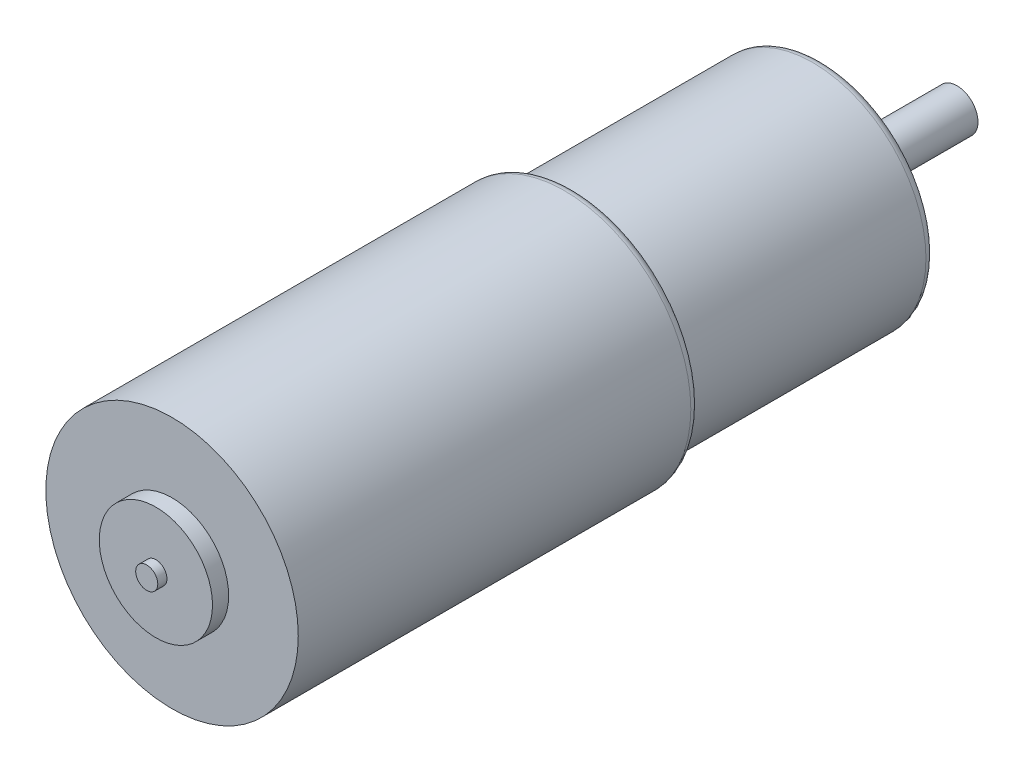
ISO-10303-21;
HEADER;
FILE_DESCRIPTION(('STEP AP214'),'2;1');
FILE_NAME('part.step','',(''),(''),'','','');
FILE_SCHEMA(('AUTOMOTIVE_DESIGN { 1 0 10303 214 1 1 1 1 }'));
ENDSEC;
DATA;
#1=APPLICATION_CONTEXT('core data for automotive mechanical design processes');
#2=APPLICATION_PROTOCOL_DEFINITION('international standard','automotive_design',2000,#1);
#3=PRODUCT_CONTEXT('',#1,'mechanical');
#4=PRODUCT('Part','Part','',(#3));
#5=PRODUCT_RELATED_PRODUCT_CATEGORY('part','',(#4));
#6=PRODUCT_DEFINITION_FORMATION('','',#4);
#7=PRODUCT_DEFINITION_CONTEXT('part definition',#1,'design');
#8=PRODUCT_DEFINITION('design','',#6,#7);
#9=PRODUCT_DEFINITION_SHAPE('','',#8);
#10=(LENGTH_UNIT() NAMED_UNIT(*) SI_UNIT(.MILLI.,.METRE.));
#11=(NAMED_UNIT(*) PLANE_ANGLE_UNIT() SI_UNIT($,.RADIAN.));
#12=(NAMED_UNIT(*) SI_UNIT($,.STERADIAN.) SOLID_ANGLE_UNIT());
#13=UNCERTAINTY_MEASURE_WITH_UNIT(LENGTH_MEASURE(1.E-05),#10,'distance_accuracy_value','');
#14=(GEOMETRIC_REPRESENTATION_CONTEXT(3) GLOBAL_UNCERTAINTY_ASSIGNED_CONTEXT((#13)) GLOBAL_UNIT_ASSIGNED_CONTEXT((#10,
#11,#12)) REPRESENTATION_CONTEXT('',''));
#15=CARTESIAN_POINT('',(0.,0.,0.));
#16=DIRECTION('',(0.,0.,1.));
#17=DIRECTION('',(1.,0.,0.));
#18=AXIS2_PLACEMENT_3D('',#15,#16,#17);
#19=CARTESIAN_POINT('',(0.,0.,3.5814));
#20=DIRECTION('',(0.,0.,1.));
#21=DIRECTION('',(1.,0.,0.));
#22=AXIS2_PLACEMENT_3D('',#19,#20,#21);
#23=CYLINDRICAL_SURFACE('',#22,9.9441);
#24=CARTESIAN_POINT('',(0.,0.,-94.9452));
#25=DIRECTION('',(0.,0.,1.));
#26=DIRECTION('',(1.,0.,0.));
#27=AXIS2_PLACEMENT_3D('',#24,#25,#26);
#28=CIRCLE('',#27,9.94410000000001);
#29=CARTESIAN_POINT('',(9.017,4.19271222599407,-94.9452));
#30=VERTEX_POINT('',#29);
#31=CARTESIAN_POINT('',(-9.017,4.19271222599407,-94.9452));
#32=VERTEX_POINT('',#31);
#33=EDGE_CURVE('E195',#30,#32,#28,.T.);
#34=ORIENTED_EDGE('',*,*,#33,.T.);
#35=DIRECTION('',(0.,0.,-1.));
#36=VECTOR('',#35,1.);
#37=CARTESIAN_POINT('',(-9.017,4.19271222599407,-83.5622807147734));
#38=LINE('',#37,#36);
#39=CARTESIAN_POINT('',(-9.017,4.19271222599407,-91.9988));
#40=VERTEX_POINT('',#39);
#41=EDGE_CURVE('E123',#40,#32,#38,.T.);
#42=ORIENTED_EDGE('',*,*,#41,.F.);
#43=CARTESIAN_POINT('',(0.,0.,-91.9988));
#44=DIRECTION('',(0.,0.,1.));
#45=DIRECTION('',(1.,0.,0.));
#46=AXIS2_PLACEMENT_3D('',#43,#44,#45);
#47=CIRCLE('',#46,9.9441);
#48=CARTESIAN_POINT('',(9.017,4.19271222599406,-91.9988));
#49=VERTEX_POINT('',#48);
#50=EDGE_CURVE('E192',#49,#40,#47,.T.);
#51=ORIENTED_EDGE('',*,*,#50,.F.);
#52=DIRECTION('',(0.,0.,-1.));
#53=VECTOR('',#52,1.);
#54=CARTESIAN_POINT('',(9.017,4.19271222599407,-83.5622807147734));
#55=LINE('',#54,#53);
#56=EDGE_CURVE('E130',#49,#30,#55,.T.);
#57=ORIENTED_EDGE('',*,*,#56,.T.);
#58=EDGE_LOOP('',(#34,#42,#51,#57));
#59=FACE_BOUND('',#58,.T.);
#60=ADVANCED_FACE('F34',(#59),#23,.T.);
#61=CARTESIAN_POINT('',(0.,2.9718,-94.9452));
#62=DIRECTION('',(0.,0.,1.));
#63=DIRECTION('',(1.,0.,0.));
#64=AXIS2_PLACEMENT_3D('',#61,#62,#63);
#65=PLANE('',#64);
#66=CARTESIAN_POINT('',(0.,0.,-94.9452));
#67=DIRECTION('',(0.,0.,1.));
#68=DIRECTION('',(1.,0.,0.));
#69=AXIS2_PLACEMENT_3D('',#66,#67,#68);
#70=CIRCLE('',#69,2.9718);
#71=CARTESIAN_POINT('',(2.9718,0.,-94.9452));
#72=VERTEX_POINT('',#71);
#73=EDGE_CURVE('E42',#72,#72,#70,.T.);
#74=ORIENTED_EDGE('',*,*,#73,.T.);
#75=EDGE_LOOP('',(#74));
#76=FACE_BOUND('',#75,.T.);
#77=CARTESIAN_POINT('',(-9.017,-4.19271222599407,-94.9452));
#78=VERTEX_POINT('',#77);
#79=CARTESIAN_POINT('',(9.017,-4.19271222599407,-94.9452));
#80=VERTEX_POINT('',#79);
#81=EDGE_CURVE('E194',#78,#80,#28,.T.);
#82=ORIENTED_EDGE('',*,*,#81,.F.);
#83=DIRECTION('',(0.,-1.,0.));
#84=VECTOR('',#83,1.);
#85=CARTESIAN_POINT('',(-9.017,0.,-94.9452));
#86=LINE('',#85,#84);
#87=EDGE_CURVE('E114',#32,#78,#86,.T.);
#88=ORIENTED_EDGE('',*,*,#87,.F.);
#89=ORIENTED_EDGE('',*,*,#33,.F.);
#90=DIRECTION('',(0.,-1.,0.));
#91=VECTOR('',#90,1.);
#92=CARTESIAN_POINT('',(9.017,0.,-94.9452));
#93=LINE('',#92,#91);
#94=EDGE_CURVE('E126',#30,#80,#93,.T.);
#95=ORIENTED_EDGE('',*,*,#94,.T.);
#96=EDGE_LOOP('',(#82,#88,#89,#95));
#97=FACE_BOUND('',#96,.T.);
#98=ADVANCED_FACE('F200',(#76,#97),#65,.F.);
#99=CARTESIAN_POINT('',(-9.017,-4.19271222599407,-91.9988));
#100=VERTEX_POINT('',#99);
#101=CARTESIAN_POINT('',(9.017,-4.19271222599407,-91.9988));
#102=VERTEX_POINT('',#101);
#103=EDGE_CURVE('E191',#100,#102,#47,.T.);
#104=ORIENTED_EDGE('',*,*,#103,.F.);
#105=DIRECTION('',(0.,0.,-1.));
#106=VECTOR('',#105,1.);
#107=CARTESIAN_POINT('',(-9.017,-4.19271222599407,-83.5622807147734));
#108=LINE('',#107,#106);
#109=EDGE_CURVE('E120',#100,#78,#108,.T.);
#110=ORIENTED_EDGE('',*,*,#109,.T.);
#111=ORIENTED_EDGE('',*,*,#81,.T.);
#112=DIRECTION('',(0.,0.,-1.));
#113=VECTOR('',#112,1.);
#114=CARTESIAN_POINT('',(9.017,-4.19271222599407,-83.5622807147734));
#115=LINE('',#114,#113);
#116=EDGE_CURVE('E133',#102,#80,#115,.T.);
#117=ORIENTED_EDGE('',*,*,#116,.F.);
#118=EDGE_LOOP('',(#104,#110,#111,#117));
#119=FACE_BOUND('',#118,.T.);
#120=ADVANCED_FACE('F211',(#119),#23,.T.);
#121=CARTESIAN_POINT('',(0.,0.,-111.125));
#122=DIRECTION('',(0.,0.,1.));
#123=DIRECTION('',(1.,0.,0.));
#124=AXIS2_PLACEMENT_3D('',#121,#122,#123);
#125=PLANE('',#124);
#126=CARTESIAN_POINT('',(0.,0.,-111.125));
#127=DIRECTION('',(0.,0.,1.));
#128=DIRECTION('',(1.,0.,0.));
#129=AXIS2_PLACEMENT_3D('',#126,#127,#128);
#130=CIRCLE('',#129,2.9718);
#131=CARTESIAN_POINT('',(-2.2809143429774,-1.905,-111.125));
#132=VERTEX_POINT('',#131);
#133=CARTESIAN_POINT('',(-2.2809143429774,1.905,-111.125));
#134=VERTEX_POINT('',#133);
#135=EDGE_CURVE('E11',#132,#134,#130,.T.);
#136=ORIENTED_EDGE('',*,*,#135,.F.);
#137=DIRECTION('',(0.,-1.,0.));
#138=VECTOR('',#137,1.);
#139=CARTESIAN_POINT('',(-2.2809143429774,0.,-111.125));
#140=LINE('',#139,#138);
#141=EDGE_CURVE('E102',#134,#132,#140,.T.);
#142=ORIENTED_EDGE('',*,*,#141,.F.);
#143=EDGE_LOOP('',(#136,#142));
#144=FACE_BOUND('',#143,.T.);
#145=ADVANCED_FACE('F36',(#144),#125,.F.);
#146=CARTESIAN_POINT('',(0.,0.,3.5814));
#147=DIRECTION('',(0.,0.,1.));
#148=DIRECTION('',(1.,0.,0.));
#149=AXIS2_PLACEMENT_3D('',#146,#147,#148);
#150=CYLINDRICAL_SURFACE('',#149,2.9718);
#151=ORIENTED_EDGE('',*,*,#135,.T.);
#152=DIRECTION('',(0.,0.,-1.));
#153=VECTOR('',#152,1.);
#154=CARTESIAN_POINT('',(-2.2809143429774,1.905,-99.314));
#155=LINE('',#154,#153);
#156=CARTESIAN_POINT('',(-2.2809143429774,1.905,-99.314));
#157=VERTEX_POINT('',#156);
#158=EDGE_CURVE('E106',#157,#134,#155,.T.);
#159=ORIENTED_EDGE('',*,*,#158,.F.);
#160=CARTESIAN_POINT('',(0.,0.,-99.314));
#161=DIRECTION('',(0.,0.,-1.));
#162=DIRECTION('',(-1.,0.,0.));
#163=AXIS2_PLACEMENT_3D('',#160,#161,#162);
#164=CIRCLE('',#163,2.9718);
#165=CARTESIAN_POINT('',(-2.28091434297739,-1.905,-99.314));
#166=VERTEX_POINT('',#165);
#167=EDGE_CURVE('E97',#166,#157,#164,.T.);
#168=ORIENTED_EDGE('',*,*,#167,.F.);
#169=DIRECTION('',(0.,0.,-1.));
#170=VECTOR('',#169,1.);
#171=CARTESIAN_POINT('',(-2.2809143429774,-1.905,-99.314));
#172=LINE('',#171,#170);
#173=EDGE_CURVE('E108',#166,#132,#172,.T.);
#174=ORIENTED_EDGE('',*,*,#173,.T.);
#175=EDGE_LOOP('',(#151,#159,#168,#174));
#176=FACE_BOUND('',#175,.T.);
#177=ORIENTED_EDGE('',*,*,#73,.F.);
#178=EDGE_LOOP('',(#177));
#179=FACE_BOUND('',#178,.T.);
#180=ADVANCED_FACE('F110',(#176,#179),#150,.T.);
#181=CARTESIAN_POINT('',(0.,9.9441,-91.9988));
#182=DIRECTION('',(0.,0.,1.));
#183=DIRECTION('',(1.,0.,0.));
#184=AXIS2_PLACEMENT_3D('',#181,#182,#183);
#185=PLANE('',#184);
#186=CARTESIAN_POINT('',(-9.,9.,-91.9988));
#187=DIRECTION('',(0.,0.,-1.));
#188=DIRECTION('',(-1.,0.,0.));
#189=AXIS2_PLACEMENT_3D('',#186,#187,#188);
#190=CIRCLE('',#189,1.1303);
#191=CARTESIAN_POINT('',(-10.1303,9.,-91.9988));
#192=VERTEX_POINT('',#191);
#193=EDGE_CURVE('E129',#192,#192,#190,.T.);
#194=ORIENTED_EDGE('',*,*,#193,.F.);
#195=EDGE_LOOP('',(#194));
#196=FACE_BOUND('',#195,.T.);
#197=CARTESIAN_POINT('',(9.,-9.,-91.9988));
#198=DIRECTION('',(0.,0.,-1.));
#199=DIRECTION('',(-1.,0.,0.));
#200=AXIS2_PLACEMENT_3D('',#197,#198,#199);
#201=CIRCLE('',#200,1.1303);
#202=CARTESIAN_POINT('',(7.8697,-9.,-91.9988));
#203=VERTEX_POINT('',#202);
#204=EDGE_CURVE('E143',#203,#203,#201,.T.);
#205=ORIENTED_EDGE('',*,*,#204,.F.);
#206=EDGE_LOOP('',(#205));
#207=FACE_BOUND('',#206,.T.);
#208=CARTESIAN_POINT('',(9.,9.,-91.9988));
#209=DIRECTION('',(0.,0.,-1.));
#210=DIRECTION('',(-1.,0.,0.));
#211=AXIS2_PLACEMENT_3D('',#208,#209,#210);
#212=CIRCLE('',#211,1.1303);
#213=CARTESIAN_POINT('',(7.8697,9.,-91.9988));
#214=VERTEX_POINT('',#213);
#215=EDGE_CURVE('E149',#214,#214,#212,.T.);
#216=ORIENTED_EDGE('',*,*,#215,.F.);
#217=EDGE_LOOP('',(#216));
#218=FACE_BOUND('',#217,.T.);
#219=CARTESIAN_POINT('',(-9.,-9.,-91.9988));
#220=DIRECTION('',(0.,0.,-1.));
#221=DIRECTION('',(-1.,0.,0.));
#222=AXIS2_PLACEMENT_3D('',#219,#220,#221);
#223=CIRCLE('',#222,1.1303);
#224=CARTESIAN_POINT('',(-10.1303,-9.,-91.9988));
#225=VERTEX_POINT('',#224);
#226=EDGE_CURVE('E155',#225,#225,#223,.T.);
#227=ORIENTED_EDGE('',*,*,#226,.F.);
#228=EDGE_LOOP('',(#227));
#229=FACE_BOUND('',#228,.T.);
#230=CARTESIAN_POINT('',(0.,0.,-91.9988));
#231=DIRECTION('',(0.,0.,1.));
#232=DIRECTION('',(1.,0.,0.));
#233=AXIS2_PLACEMENT_3D('',#230,#231,#232);
#234=CIRCLE('',#233,14.732);
#235=CARTESIAN_POINT('',(14.732,0.,-91.9988));
#236=VERTEX_POINT('',#235);
#237=EDGE_CURVE('E188',#236,#236,#234,.T.);
#238=ORIENTED_EDGE('',*,*,#237,.F.);
#239=EDGE_LOOP('',(#238));
#240=FACE_BOUND('',#239,.T.);
#241=ORIENTED_EDGE('',*,*,#50,.T.);
#242=DIRECTION('',(0.,-1.,0.));
#243=VECTOR('',#242,1.);
#244=CARTESIAN_POINT('',(-9.017,0.,-91.9988));
#245=LINE('',#244,#243);
#246=EDGE_CURVE('E56',#40,#100,#245,.T.);
#247=ORIENTED_EDGE('',*,*,#246,.T.);
#248=ORIENTED_EDGE('',*,*,#103,.T.);
#249=DIRECTION('',(0.,-1.,0.));
#250=VECTOR('',#249,1.);
#251=CARTESIAN_POINT('',(9.017,0.,-91.9988));
#252=LINE('',#251,#250);
#253=EDGE_CURVE('E125',#49,#102,#252,.T.);
#254=ORIENTED_EDGE('',*,*,#253,.F.);
#255=EDGE_LOOP('',(#241,#247,#248,#254));
#256=FACE_BOUND('',#255,.T.);
#257=ADVANCED_FACE('F203',(#196,#207,#218,#229,#240,#256),#185,.F.);
#258=CARTESIAN_POINT('',(0.,0.,-90.7288));
#259=DIRECTION('',(0.,0.,1.));
#260=DIRECTION('',(1.,0.,0.));
#261=AXIS2_PLACEMENT_3D('',#258,#259,#260);
#262=TOROIDAL_SURFACE('',#261,14.732,1.27);
#263=CARTESIAN_POINT('',(0.,0.,-90.7288));
#264=DIRECTION('',(0.,0.,1.));
#265=DIRECTION('',(1.,0.,0.));
#266=AXIS2_PLACEMENT_3D('',#263,#264,#265);
#267=CIRCLE('',#266,16.002);
#268=CARTESIAN_POINT('',(16.002,0.,-90.7288));
#269=VERTEX_POINT('',#268);
#270=EDGE_CURVE('E185',#269,#269,#267,.T.);
#271=ORIENTED_EDGE('',*,*,#270,.F.);
#272=EDGE_LOOP('',(#271));
#273=FACE_BOUND('',#272,.T.);
#274=ORIENTED_EDGE('',*,*,#237,.T.);
#275=EDGE_LOOP('',(#274));
#276=FACE_BOUND('',#275,.T.);
#277=ADVANCED_FACE('F208',(#273,#276),#262,.T.);
#278=CARTESIAN_POINT('',(0.,0.,3.5814));
#279=DIRECTION('',(0.,0.,1.));
#280=DIRECTION('',(1.,0.,0.));
#281=AXIS2_PLACEMENT_3D('',#278,#279,#280);
#282=CYLINDRICAL_SURFACE('',#281,16.002);
#283=CARTESIAN_POINT('',(0.,0.,-56.8452));
#284=DIRECTION('',(0.,0.,1.));
#285=DIRECTION('',(1.,0.,0.));
#286=AXIS2_PLACEMENT_3D('',#283,#284,#285);
#287=CIRCLE('',#286,16.002);
#288=CARTESIAN_POINT('',(16.002,0.,-56.8452));
#289=VERTEX_POINT('',#288);
#290=EDGE_CURVE('E182',#289,#289,#287,.T.);
#291=ORIENTED_EDGE('',*,*,#290,.F.);
#292=EDGE_LOOP('',(#291));
#293=FACE_BOUND('',#292,.T.);
#294=ORIENTED_EDGE('',*,*,#270,.T.);
#295=EDGE_LOOP('',(#294));
#296=FACE_BOUND('',#295,.T.);
#297=ADVANCED_FACE('F309',(#293,#296),#282,.T.);
#298=CARTESIAN_POINT('',(0.,16.002,-56.8452));
#299=DIRECTION('',(0.,0.,1.));
#300=DIRECTION('',(1.,0.,0.));
#301=AXIS2_PLACEMENT_3D('',#298,#299,#300);
#302=PLANE('',#301);
#303=CARTESIAN_POINT('',(0.,0.,-56.8452));
#304=DIRECTION('',(0.,0.,1.));
#305=DIRECTION('',(1.,0.,0.));
#306=AXIS2_PLACEMENT_3D('',#303,#304,#305);
#307=CIRCLE('',#306,16.5989);
#308=CARTESIAN_POINT('',(16.5989,0.,-56.8452));
#309=VERTEX_POINT('',#308);
#310=EDGE_CURVE('E179',#309,#309,#307,.T.);
#311=ORIENTED_EDGE('',*,*,#310,.F.);
#312=EDGE_LOOP('',(#311));
#313=FACE_BOUND('',#312,.T.);
#314=ORIENTED_EDGE('',*,*,#290,.T.);
#315=EDGE_LOOP('',(#314));
#316=FACE_BOUND('',#315,.T.);
#317=ADVANCED_FACE('F305',(#313,#316),#302,.F.);
#318=CARTESIAN_POINT('',(0.,0.,-55.5752));
#319=DIRECTION('',(0.,0.,1.));
#320=DIRECTION('',(1.,0.,0.));
#321=AXIS2_PLACEMENT_3D('',#318,#319,#320);
#322=TOROIDAL_SURFACE('',#321,16.5989,1.27);
#323=CARTESIAN_POINT('',(0.,0.,-55.5752));
#324=DIRECTION('',(0.,0.,1.));
#325=DIRECTION('',(1.,0.,0.));
#326=AXIS2_PLACEMENT_3D('',#323,#324,#325);
#327=CIRCLE('',#326,17.8689);
#328=CARTESIAN_POINT('',(17.8689,0.,-55.5752));
#329=VERTEX_POINT('',#328);
#330=EDGE_CURVE('E176',#329,#329,#327,.T.);
#331=ORIENTED_EDGE('',*,*,#330,.F.);
#332=EDGE_LOOP('',(#331));
#333=FACE_BOUND('',#332,.T.);
#334=ORIENTED_EDGE('',*,*,#310,.T.);
#335=EDGE_LOOP('',(#334));
#336=FACE_BOUND('',#335,.T.);
#337=ADVANCED_FACE('F301',(#333,#336),#322,.T.);
#338=CARTESIAN_POINT('',(0.,0.,3.5814));
#339=DIRECTION('',(0.,0.,1.));
#340=DIRECTION('',(1.,0.,0.));
#341=AXIS2_PLACEMENT_3D('',#338,#339,#340);
#342=CYLINDRICAL_SURFACE('',#341,17.8689);
#343=CARTESIAN_POINT('',(0.,0.,0.));
#344=DIRECTION('',(0.,0.,1.));
#345=DIRECTION('',(1.,0.,0.));
#346=AXIS2_PLACEMENT_3D('',#343,#344,#345);
#347=CIRCLE('',#346,17.8689);
#348=CARTESIAN_POINT('',(17.8689,0.,0.));
#349=VERTEX_POINT('',#348);
#350=EDGE_CURVE('E173',#349,#349,#347,.T.);
#351=ORIENTED_EDGE('',*,*,#350,.F.);
#352=EDGE_LOOP('',(#351));
#353=FACE_BOUND('',#352,.T.);
#354=ORIENTED_EDGE('',*,*,#330,.T.);
#355=EDGE_LOOP('',(#354));
#356=FACE_BOUND('',#355,.T.);
#357=ADVANCED_FACE('F297',(#353,#356),#342,.T.);
#358=CARTESIAN_POINT('',(0.,17.8689,0.));
#359=DIRECTION('',(0.,0.,-1.));
#360=DIRECTION('',(-1.,0.,0.));
#361=AXIS2_PLACEMENT_3D('',#358,#359,#360);
#362=PLANE('',#361);
#363=CARTESIAN_POINT('',(0.,0.,0.));
#364=DIRECTION('',(0.,0.,1.));
#365=DIRECTION('',(1.,0.,0.));
#366=AXIS2_PLACEMENT_3D('',#363,#364,#365);
#367=CIRCLE('',#366,8.0137);
#368=CARTESIAN_POINT('',(8.0137,0.,0.));
#369=VERTEX_POINT('',#368);
#370=EDGE_CURVE('E170',#369,#369,#367,.T.);
#371=ORIENTED_EDGE('',*,*,#370,.F.);
#372=EDGE_LOOP('',(#371));
#373=FACE_BOUND('',#372,.T.);
#374=ORIENTED_EDGE('',*,*,#350,.T.);
#375=EDGE_LOOP('',(#374));
#376=FACE_BOUND('',#375,.T.);
#377=ADVANCED_FACE('F293',(#373,#376),#362,.F.);
#378=CARTESIAN_POINT('',(0.,0.,3.5814));
#379=DIRECTION('',(0.,0.,1.));
#380=DIRECTION('',(1.,0.,0.));
#381=AXIS2_PLACEMENT_3D('',#378,#379,#380);
#382=CYLINDRICAL_SURFACE('',#381,8.0137);
#383=CARTESIAN_POINT('',(0.,0.,2.286));
#384=DIRECTION('',(0.,0.,1.));
#385=DIRECTION('',(1.,0.,0.));
#386=AXIS2_PLACEMENT_3D('',#383,#384,#385);
#387=CIRCLE('',#386,8.0137);
#388=CARTESIAN_POINT('',(8.0137,0.,2.286));
#389=VERTEX_POINT('',#388);
#390=EDGE_CURVE('E167',#389,#389,#387,.T.);
#391=ORIENTED_EDGE('',*,*,#390,.F.);
#392=EDGE_LOOP('',(#391));
#393=FACE_BOUND('',#392,.T.);
#394=ORIENTED_EDGE('',*,*,#370,.T.);
#395=EDGE_LOOP('',(#394));
#396=FACE_BOUND('',#395,.T.);
#397=ADVANCED_FACE('F289',(#393,#396),#382,.T.);
#398=CARTESIAN_POINT('',(0.,8.0137,2.286));
#399=DIRECTION('',(0.,0.,-1.));
#400=DIRECTION('',(-1.,0.,0.));
#401=AXIS2_PLACEMENT_3D('',#398,#399,#400);
#402=PLANE('',#401);
#403=CARTESIAN_POINT('',(0.,0.,2.286));
#404=DIRECTION('',(0.,0.,1.));
#405=DIRECTION('',(1.,0.,0.));
#406=AXIS2_PLACEMENT_3D('',#403,#404,#405);
#407=CIRCLE('',#406,1.5621);
#408=CARTESIAN_POINT('',(1.5621,0.,2.286));
#409=VERTEX_POINT('',#408);
#410=EDGE_CURVE('E164',#409,#409,#407,.T.);
#411=ORIENTED_EDGE('',*,*,#410,.F.);
#412=EDGE_LOOP('',(#411));
#413=FACE_BOUND('',#412,.T.);
#414=ORIENTED_EDGE('',*,*,#390,.T.);
#415=EDGE_LOOP('',(#414));
#416=FACE_BOUND('',#415,.T.);
#417=ADVANCED_FACE('F285',(#413,#416),#402,.F.);
#418=CARTESIAN_POINT('',(0.,0.,3.5814));
#419=DIRECTION('',(0.,0.,1.));
#420=DIRECTION('',(1.,0.,0.));
#421=AXIS2_PLACEMENT_3D('',#418,#419,#420);
#422=CYLINDRICAL_SURFACE('',#421,1.5621);
#423=CARTESIAN_POINT('',(0.,0.,3.5814));
#424=DIRECTION('',(0.,0.,1.));
#425=DIRECTION('',(1.,0.,0.));
#426=AXIS2_PLACEMENT_3D('',#423,#424,#425);
#427=CIRCLE('',#426,1.5621);
#428=CARTESIAN_POINT('',(1.5621,0.,3.5814));
#429=VERTEX_POINT('',#428);
#430=EDGE_CURVE('E161',#429,#429,#427,.T.);
#431=ORIENTED_EDGE('',*,*,#430,.F.);
#432=EDGE_LOOP('',(#431));
#433=FACE_BOUND('',#432,.T.);
#434=ORIENTED_EDGE('',*,*,#410,.T.);
#435=EDGE_LOOP('',(#434));
#436=FACE_BOUND('',#435,.T.);
#437=ADVANCED_FACE('F281',(#433,#436),#422,.T.);
#438=CARTESIAN_POINT('',(0.,1.5621,3.5814));
#439=DIRECTION('',(0.,0.,-1.));
#440=DIRECTION('',(-1.,0.,0.));
#441=AXIS2_PLACEMENT_3D('',#438,#439,#440);
#442=PLANE('',#441);
#443=ORIENTED_EDGE('',*,*,#430,.T.);
#444=EDGE_LOOP('',(#443));
#445=FACE_BOUND('',#444,.T.);
#446=ADVANCED_FACE('F277',(#445),#442,.F.);
#447=CARTESIAN_POINT('',(-9.,-9.,-86.9188));
#448=DIRECTION('',(0.,0.,-1.));
#449=DIRECTION('',(-1.,0.,0.));
#450=AXIS2_PLACEMENT_3D('',#447,#448,#449);
#451=CONICAL_SURFACE('',#450,1.1303,1.02974425867666);
#452=CARTESIAN_POINT('',(-9.,-9.,-86.2396472423131));
#453=VERTEX_POINT('',#452);
#454=VERTEX_LOOP('',#453);
#455=FACE_BOUND('',#454,.T.);
#456=CARTESIAN_POINT('',(-9.,-9.,-86.9188));
#457=DIRECTION('',(0.,0.,-1.));
#458=DIRECTION('',(-1.,0.,0.));
#459=AXIS2_PLACEMENT_3D('',#456,#457,#458);
#460=CIRCLE('',#459,1.1303);
#461=CARTESIAN_POINT('',(-10.1303,-9.,-86.9188));
#462=VERTEX_POINT('',#461);
#463=EDGE_CURVE('E158',#462,#462,#460,.T.);
#464=ORIENTED_EDGE('',*,*,#463,.T.);
#465=EDGE_LOOP('',(#464));
#466=FACE_BOUND('',#465,.T.);
#467=ADVANCED_FACE('F273',(#455,#466),#451,.F.);
#468=CARTESIAN_POINT('',(-9.,-9.,-91.9988));
#469=DIRECTION('',(0.,0.,-1.));
#470=DIRECTION('',(-1.,0.,0.));
#471=AXIS2_PLACEMENT_3D('',#468,#469,#470);
#472=CYLINDRICAL_SURFACE('',#471,1.1303);
#473=ORIENTED_EDGE('',*,*,#463,.F.);
#474=EDGE_LOOP('',(#473));
#475=FACE_BOUND('',#474,.T.);
#476=ORIENTED_EDGE('',*,*,#226,.T.);
#477=EDGE_LOOP('',(#476));
#478=FACE_BOUND('',#477,.T.);
#479=ADVANCED_FACE('F269',(#475,#478),#472,.F.);
#480=CARTESIAN_POINT('',(9.,9.,-86.9188));
#481=DIRECTION('',(0.,0.,-1.));
#482=DIRECTION('',(-1.,0.,0.));
#483=AXIS2_PLACEMENT_3D('',#480,#481,#482);
#484=CONICAL_SURFACE('',#483,1.1303,1.02974425867666);
#485=CARTESIAN_POINT('',(9.,9.,-86.2396472423131));
#486=VERTEX_POINT('',#485);
#487=VERTEX_LOOP('',#486);
#488=FACE_BOUND('',#487,.T.);
#489=CARTESIAN_POINT('',(9.,9.,-86.9188));
#490=DIRECTION('',(0.,0.,-1.));
#491=DIRECTION('',(-1.,0.,0.));
#492=AXIS2_PLACEMENT_3D('',#489,#490,#491);
#493=CIRCLE('',#492,1.1303);
#494=CARTESIAN_POINT('',(7.8697,9.,-86.9188));
#495=VERTEX_POINT('',#494);
#496=EDGE_CURVE('E152',#495,#495,#493,.T.);
#497=ORIENTED_EDGE('',*,*,#496,.T.);
#498=EDGE_LOOP('',(#497));
#499=FACE_BOUND('',#498,.T.);
#500=ADVANCED_FACE('F265',(#488,#499),#484,.F.);
#501=CARTESIAN_POINT('',(9.,9.,-91.9988));
#502=DIRECTION('',(0.,0.,-1.));
#503=DIRECTION('',(-1.,0.,0.));
#504=AXIS2_PLACEMENT_3D('',#501,#502,#503);
#505=CYLINDRICAL_SURFACE('',#504,1.1303);
#506=ORIENTED_EDGE('',*,*,#496,.F.);
#507=EDGE_LOOP('',(#506));
#508=FACE_BOUND('',#507,.T.);
#509=ORIENTED_EDGE('',*,*,#215,.T.);
#510=EDGE_LOOP('',(#509));
#511=FACE_BOUND('',#510,.T.);
#512=ADVANCED_FACE('F261',(#508,#511),#505,.F.);
#513=CARTESIAN_POINT('',(9.,-9.,-86.9188));
#514=DIRECTION('',(0.,0.,-1.));
#515=DIRECTION('',(-1.,0.,0.));
#516=AXIS2_PLACEMENT_3D('',#513,#514,#515);
#517=CONICAL_SURFACE('',#516,1.1303,1.02974425867666);
#518=CARTESIAN_POINT('',(9.,-9.,-86.2396472423131));
#519=VERTEX_POINT('',#518);
#520=VERTEX_LOOP('',#519);
#521=FACE_BOUND('',#520,.T.);
#522=CARTESIAN_POINT('',(9.,-9.,-86.9188));
#523=DIRECTION('',(0.,0.,-1.));
#524=DIRECTION('',(-1.,0.,0.));
#525=AXIS2_PLACEMENT_3D('',#522,#523,#524);
#526=CIRCLE('',#525,1.1303);
#527=CARTESIAN_POINT('',(7.8697,-9.,-86.9188));
#528=VERTEX_POINT('',#527);
#529=EDGE_CURVE('E146',#528,#528,#526,.T.);
#530=ORIENTED_EDGE('',*,*,#529,.T.);
#531=EDGE_LOOP('',(#530));
#532=FACE_BOUND('',#531,.T.);
#533=ADVANCED_FACE('F257',(#521,#532),#517,.F.);
#534=CARTESIAN_POINT('',(9.,-9.,-91.9988));
#535=DIRECTION('',(0.,0.,-1.));
#536=DIRECTION('',(-1.,0.,0.));
#537=AXIS2_PLACEMENT_3D('',#534,#535,#536);
#538=CYLINDRICAL_SURFACE('',#537,1.1303);
#539=ORIENTED_EDGE('',*,*,#529,.F.);
#540=EDGE_LOOP('',(#539));
#541=FACE_BOUND('',#540,.T.);
#542=ORIENTED_EDGE('',*,*,#204,.T.);
#543=EDGE_LOOP('',(#542));
#544=FACE_BOUND('',#543,.T.);
#545=ADVANCED_FACE('F253',(#541,#544),#538,.F.);
#546=CARTESIAN_POINT('',(-9.,9.,-86.9188));
#547=DIRECTION('',(0.,0.,-1.));
#548=DIRECTION('',(-1.,0.,0.));
#549=AXIS2_PLACEMENT_3D('',#546,#547,#548);
#550=CONICAL_SURFACE('',#549,1.1303,1.02974425867666);
#551=CARTESIAN_POINT('',(-9.,9.,-86.2396472423131));
#552=VERTEX_POINT('',#551);
#553=VERTEX_LOOP('',#552);
#554=FACE_BOUND('',#553,.T.);
#555=CARTESIAN_POINT('',(-9.,9.,-86.9188));
#556=DIRECTION('',(0.,0.,-1.));
#557=DIRECTION('',(-1.,0.,0.));
#558=AXIS2_PLACEMENT_3D('',#555,#556,#557);
#559=CIRCLE('',#558,1.1303);
#560=CARTESIAN_POINT('',(-10.1303,9.,-86.9188));
#561=VERTEX_POINT('',#560);
#562=EDGE_CURVE('E140',#561,#561,#559,.T.);
#563=ORIENTED_EDGE('',*,*,#562,.T.);
#564=EDGE_LOOP('',(#563));
#565=FACE_BOUND('',#564,.T.);
#566=ADVANCED_FACE('F249',(#554,#565),#550,.F.);
#567=CARTESIAN_POINT('',(-9.,9.,-91.9988));
#568=DIRECTION('',(0.,0.,-1.));
#569=DIRECTION('',(-1.,0.,0.));
#570=AXIS2_PLACEMENT_3D('',#567,#568,#569);
#571=CYLINDRICAL_SURFACE('',#570,1.1303);
#572=ORIENTED_EDGE('',*,*,#562,.F.);
#573=EDGE_LOOP('',(#572));
#574=FACE_BOUND('',#573,.T.);
#575=ORIENTED_EDGE('',*,*,#193,.T.);
#576=EDGE_LOOP('',(#575));
#577=FACE_BOUND('',#576,.T.);
#578=ADVANCED_FACE('F243',(#574,#577),#571,.F.);
#579=CARTESIAN_POINT('',(9.017,0.,-83.5622807147734));
#580=DIRECTION('',(1.,0.,0.));
#581=DIRECTION('',(0.,0.,-1.));
#582=AXIS2_PLACEMENT_3D('',#579,#580,#581);
#583=PLANE('',#582);
#584=ORIENTED_EDGE('',*,*,#253,.T.);
#585=ORIENTED_EDGE('',*,*,#116,.T.);
#586=ORIENTED_EDGE('',*,*,#94,.F.);
#587=ORIENTED_EDGE('',*,*,#56,.F.);
#588=EDGE_LOOP('',(#584,#585,#586,#587));
#589=FACE_BOUND('',#588,.T.);
#590=ADVANCED_FACE('F230',(#589),#583,.T.);
#591=CARTESIAN_POINT('',(-9.017,0.,-83.5622807147734));
#592=DIRECTION('',(1.,0.,0.));
#593=DIRECTION('',(0.,0.,-1.));
#594=AXIS2_PLACEMENT_3D('',#591,#592,#593);
#595=PLANE('',#594);
#596=ORIENTED_EDGE('',*,*,#41,.T.);
#597=ORIENTED_EDGE('',*,*,#87,.T.);
#598=ORIENTED_EDGE('',*,*,#109,.F.);
#599=ORIENTED_EDGE('',*,*,#246,.F.);
#600=EDGE_LOOP('',(#596,#597,#598,#599));
#601=FACE_BOUND('',#600,.T.);
#602=ADVANCED_FACE('F235',(#601),#595,.F.);
#603=CARTESIAN_POINT('',(-2.2809143429774,0.,-99.314));
#604=DIRECTION('',(1.,0.,0.));
#605=DIRECTION('',(0.,0.,-1.));
#606=AXIS2_PLACEMENT_3D('',#603,#604,#605);
#607=PLANE('',#606);
#608=ORIENTED_EDGE('',*,*,#141,.T.);
#609=ORIENTED_EDGE('',*,*,#173,.F.);
#610=DIRECTION('',(0.,-1.,0.));
#611=VECTOR('',#610,1.);
#612=CARTESIAN_POINT('',(-2.2809143429774,0.,-99.314));
#613=LINE('',#612,#611);
#614=EDGE_CURVE('E48',#157,#166,#613,.T.);
#615=ORIENTED_EDGE('',*,*,#614,.F.);
#616=ORIENTED_EDGE('',*,*,#158,.T.);
#617=EDGE_LOOP('',(#608,#609,#615,#616));
#618=FACE_BOUND('',#617,.T.);
#619=ADVANCED_FACE('F105',(#618),#607,.F.);
#620=CARTESIAN_POINT('',(0.,0.,-99.314));
#621=DIRECTION('',(0.,0.,-1.));
#622=DIRECTION('',(-1.,0.,0.));
#623=AXIS2_PLACEMENT_3D('',#620,#621,#622);
#624=PLANE('',#623);
#625=ORIENTED_EDGE('',*,*,#167,.T.);
#626=ORIENTED_EDGE('',*,*,#614,.T.);
#627=EDGE_LOOP('',(#625,#626));
#628=FACE_BOUND('',#627,.T.);
#629=ADVANCED_FACE('F98',(#628),#624,.T.);
#630=CLOSED_SHELL('',(#60,#98,#120,#145,#180,#257,#277,#297,#317,#337,#357,#377,#397,#417,#437,
#446,#467,#479,#500,#512,#533,#545,#566,#578,#590,#602,#619,#629));
#631=MANIFOLD_SOLID_BREP('B2',#630);
#632=ADVANCED_BREP_SHAPE_REPRESENTATION('',(#18,#631),#14);
#633=SHAPE_DEFINITION_REPRESENTATION(#9,#632);
ENDSEC;
END-ISO-10303-21;
